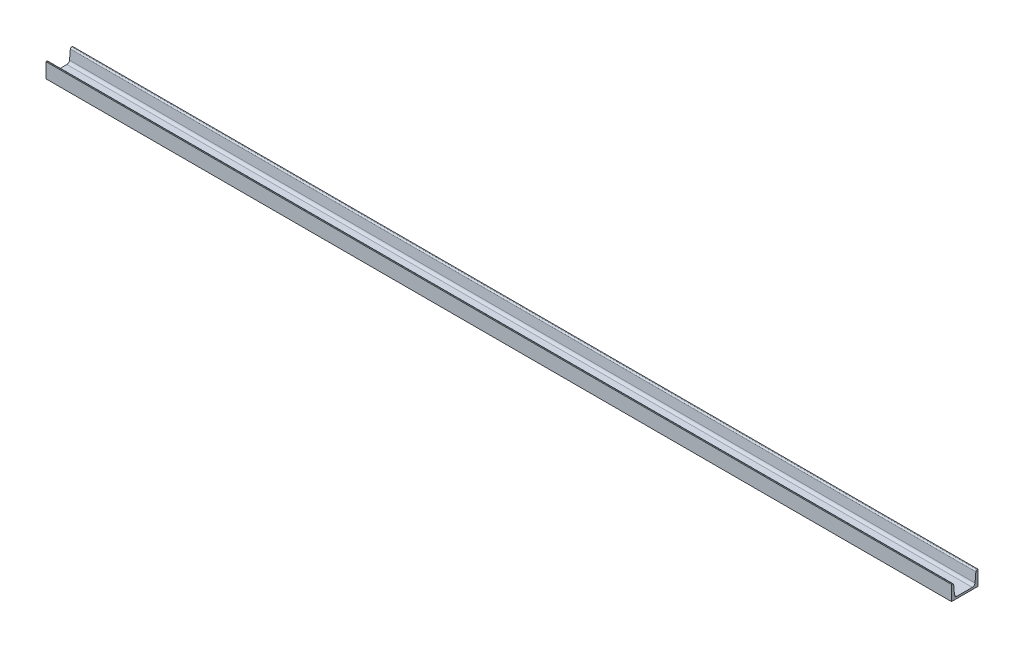
ISO-10303-21;
HEADER;
FILE_DESCRIPTION(('STEP AP214'),'2;1');
FILE_NAME('part.step','',(''),(''),'','','');
FILE_SCHEMA(('AUTOMOTIVE_DESIGN { 1 0 10303 214 1 1 1 1 }'));
ENDSEC;
DATA;
#1=APPLICATION_CONTEXT('core data for automotive mechanical design processes');
#2=APPLICATION_PROTOCOL_DEFINITION('international standard','automotive_design',2000,#1);
#3=PRODUCT_CONTEXT('',#1,'mechanical');
#4=PRODUCT('Part','Part','',(#3));
#5=PRODUCT_RELATED_PRODUCT_CATEGORY('part','',(#4));
#6=PRODUCT_DEFINITION_FORMATION('','',#4);
#7=PRODUCT_DEFINITION_CONTEXT('part definition',#1,'design');
#8=PRODUCT_DEFINITION('design','',#6,#7);
#9=PRODUCT_DEFINITION_SHAPE('','',#8);
#10=(LENGTH_UNIT() NAMED_UNIT(*) SI_UNIT(.MILLI.,.METRE.));
#11=(NAMED_UNIT(*) PLANE_ANGLE_UNIT() SI_UNIT($,.RADIAN.));
#12=(NAMED_UNIT(*) SI_UNIT($,.STERADIAN.) SOLID_ANGLE_UNIT());
#13=UNCERTAINTY_MEASURE_WITH_UNIT(LENGTH_MEASURE(1.E-05),#10,'distance_accuracy_value','');
#14=(GEOMETRIC_REPRESENTATION_CONTEXT(3) GLOBAL_UNCERTAINTY_ASSIGNED_CONTEXT((#13)) GLOBAL_UNIT_ASSIGNED_CONTEXT((#10,
#11,#12)) REPRESENTATION_CONTEXT('',''));
#15=CARTESIAN_POINT('',(0.,0.,0.));
#16=DIRECTION('',(0.,0.,1.));
#17=DIRECTION('',(1.,0.,0.));
#18=AXIS2_PLACEMENT_3D('',#15,#16,#17);
#19=CARTESIAN_POINT('',(1367.5,45.0000000000001,-37.4999999999998));
#20=DIRECTION('',(0.,-1.,0.));
#21=DIRECTION('',(0.,0.,-1.));
#22=AXIS2_PLACEMENT_3D('',#19,#20,#21);
#23=PLANE('',#22);
#24=DIRECTION('',(-1.,0.,0.));
#25=VECTOR('',#24,1.);
#26=CARTESIAN_POINT('',(1367.5,45.0000000000001,-37.4999999999998));
#27=LINE('',#26,#25);
#28=CARTESIAN_POINT('',(1367.5,45.0000000000001,-37.4999999999999));
#29=VERTEX_POINT('',#28);
#30=CARTESIAN_POINT('',(-1367.5,45.0000000000001,-37.4999999999999));
#31=VERTEX_POINT('',#30);
#32=EDGE_CURVE('E120',#29,#31,#27,.T.);
#33=ORIENTED_EDGE('',*,*,#32,.F.);
#34=DIRECTION('',(0.,0.,-1.));
#35=VECTOR('',#34,1.);
#36=CARTESIAN_POINT('',(1367.5,45.0000000000001,-37.4999999999999));
#37=LINE('',#36,#35);
#38=CARTESIAN_POINT('',(1367.5,45.0000000000001,-39.9999999999999));
#39=VERTEX_POINT('',#38);
#40=EDGE_CURVE('E102',#39,#29,#37,.F.);
#41=ORIENTED_EDGE('',*,*,#40,.F.);
#42=DIRECTION('',(1.,0.,0.));
#43=VECTOR('',#42,1.);
#44=CARTESIAN_POINT('',(1367.5,45.0000000000001,-39.9999999999998));
#45=LINE('',#44,#43);
#46=CARTESIAN_POINT('',(-1367.5,45.0000000000001,-40.));
#47=VERTEX_POINT('',#46);
#48=EDGE_CURVE('E160',#39,#47,#45,.F.);
#49=ORIENTED_EDGE('',*,*,#48,.T.);
#50=DIRECTION('',(0.,0.,-1.));
#51=VECTOR('',#50,1.);
#52=CARTESIAN_POINT('',(-1367.5,45.0000000000001,-37.4999999999999));
#53=LINE('',#52,#51);
#54=EDGE_CURVE('E163',#47,#31,#53,.F.);
#55=ORIENTED_EDGE('',*,*,#54,.T.);
#56=EDGE_LOOP('',(#33,#41,#49,#55));
#57=FACE_BOUND('',#56,.T.);
#58=ADVANCED_FACE('F17',(#57),#23,.F.);
#59=CARTESIAN_POINT('',(1367.5,41.0000000000001,-37.4999999999999));
#60=DIRECTION('',(-1.,0.,0.));
#61=DIRECTION('',(0.,0.,1.));
#62=AXIS2_PLACEMENT_3D('',#59,#60,#61);
#63=CYLINDRICAL_SURFACE('',#62,4.);
#64=CARTESIAN_POINT('',(1367.5,41.0000000000001,-37.4999999999999));
#65=DIRECTION('',(-1.,0.,0.));
#66=DIRECTION('',(0.,0.,1.));
#67=AXIS2_PLACEMENT_3D('',#64,#65,#66);
#68=CIRCLE('',#67,4.);
#69=CARTESIAN_POINT('',(1367.5,41.3615760273151,-33.5163756732754));
#70=VERTEX_POINT('',#69);
#71=EDGE_CURVE('E20',#29,#70,#68,.F.);
#72=ORIENTED_EDGE('',*,*,#71,.F.);
#73=ORIENTED_EDGE('',*,*,#32,.T.);
#74=CARTESIAN_POINT('',(-1367.5,41.0000000000001,-37.4999999999999));
#75=DIRECTION('',(-1.,0.,0.));
#76=DIRECTION('',(0.,0.,1.));
#77=AXIS2_PLACEMENT_3D('',#74,#75,#76);
#78=CIRCLE('',#77,4.);
#79=CARTESIAN_POINT('',(-1367.5,41.3615760273151,-33.5163756732754));
#80=VERTEX_POINT('',#79);
#81=EDGE_CURVE('E115',#31,#80,#78,.F.);
#82=ORIENTED_EDGE('',*,*,#81,.T.);
#83=DIRECTION('',(1.,0.,0.));
#84=VECTOR('',#83,1.);
#85=CARTESIAN_POINT('',(1367.5,41.3615760273151,-33.5163756732754));
#86=LINE('',#85,#84);
#87=EDGE_CURVE('E112',#80,#70,#86,.T.);
#88=ORIENTED_EDGE('',*,*,#87,.T.);
#89=EDGE_LOOP('',(#72,#73,#82,#88));
#90=FACE_BOUND('',#89,.T.);
#91=ADVANCED_FACE('F113',(#90),#63,.T.);
#92=CARTESIAN_POINT('',(1367.5,13.2768479453701,-30.9672486534489));
#93=DIRECTION('',(0.,-0.090394006828747,-0.995906081681121));
#94=DIRECTION('',(0.,0.995906081681121,-0.090394006828747));
#95=AXIS2_PLACEMENT_3D('',#92,#93,#94);
#96=PLANE('',#95);
#97=DIRECTION('',(-1.,0.,0.));
#98=VECTOR('',#97,1.);
#99=CARTESIAN_POINT('',(1367.5,13.2768479453701,-30.9672486534489));
#100=LINE('',#99,#98);
#101=CARTESIAN_POINT('',(-1367.5,13.2768479453701,-30.9672486534489));
#102=VERTEX_POINT('',#101);
#103=CARTESIAN_POINT('',(1367.5,13.2768479453701,-30.9672486534489));
#104=VERTEX_POINT('',#103);
#105=EDGE_CURVE('E119',#102,#104,#100,.F.);
#106=ORIENTED_EDGE('',*,*,#105,.T.);
#107=DIRECTION('',(0.,-0.995906081681121,0.0903940068287473));
#108=VECTOR('',#107,1.);
#109=CARTESIAN_POINT('',(1367.5,41.3615760273151,-33.5163756732754));
#110=LINE('',#109,#108);
#111=EDGE_CURVE('E108',#70,#104,#110,.T.);
#112=ORIENTED_EDGE('',*,*,#111,.F.);
#113=ORIENTED_EDGE('',*,*,#87,.F.);
#114=DIRECTION('',(0.,-0.995906081681121,0.0903940068287473));
#115=VECTOR('',#114,1.);
#116=CARTESIAN_POINT('',(-1367.5,41.3615760273151,-33.5163756732754));
#117=LINE('',#116,#115);
#118=EDGE_CURVE('E199',#80,#102,#117,.T.);
#119=ORIENTED_EDGE('',*,*,#118,.T.);
#120=EDGE_LOOP('',(#106,#112,#113,#119));
#121=FACE_BOUND('',#120,.T.);
#122=ADVANCED_FACE('F122',(#121),#96,.F.);
#123=CARTESIAN_POINT('',(1367.5,14.0000000000001,-23.));
#124=DIRECTION('',(-1.,0.,0.));
#125=DIRECTION('',(0.,0.,1.));
#126=AXIS2_PLACEMENT_3D('',#123,#124,#125);
#127=CYLINDRICAL_SURFACE('',#126,8.);
#128=DIRECTION('',(1.,0.,0.));
#129=VECTOR('',#128,1.);
#130=CARTESIAN_POINT('',(1367.5,6.00000000000008,-23.));
#131=LINE('',#130,#129);
#132=CARTESIAN_POINT('',(-1367.5,6.00000000000008,-23.));
#133=VERTEX_POINT('',#132);
#134=CARTESIAN_POINT('',(1367.5,6.00000000000008,-23.));
#135=VERTEX_POINT('',#134);
#136=EDGE_CURVE('E155',#133,#135,#131,.T.);
#137=ORIENTED_EDGE('',*,*,#136,.T.);
#138=CARTESIAN_POINT('',(1367.5,14.0000000000001,-23.));
#139=DIRECTION('',(-1.,0.,0.));
#140=DIRECTION('',(0.,0.,1.));
#141=AXIS2_PLACEMENT_3D('',#138,#139,#140);
#142=CIRCLE('',#141,8.);
#143=EDGE_CURVE('E124',#104,#135,#142,.T.);
#144=ORIENTED_EDGE('',*,*,#143,.F.);
#145=ORIENTED_EDGE('',*,*,#105,.F.);
#146=CARTESIAN_POINT('',(-1367.5,14.0000000000001,-23.));
#147=DIRECTION('',(-1.,0.,0.));
#148=DIRECTION('',(0.,0.,1.));
#149=AXIS2_PLACEMENT_3D('',#146,#147,#148);
#150=CIRCLE('',#149,8.);
#151=EDGE_CURVE('E196',#102,#133,#150,.T.);
#152=ORIENTED_EDGE('',*,*,#151,.T.);
#153=EDGE_LOOP('',(#137,#144,#145,#152));
#154=FACE_BOUND('',#153,.T.);
#155=ADVANCED_FACE('F259',(#154),#127,.F.);
#156=CARTESIAN_POINT('',(1367.5,5.99999999999992,23.));
#157=DIRECTION('',(0.,-1.,0.));
#158=DIRECTION('',(0.,0.,-1.));
#159=AXIS2_PLACEMENT_3D('',#156,#157,#158);
#160=PLANE('',#159);
#161=DIRECTION('',(-1.,0.,0.));
#162=VECTOR('',#161,1.);
#163=CARTESIAN_POINT('',(1367.5,5.99999999999991,23.));
#164=LINE('',#163,#162);
#165=CARTESIAN_POINT('',(-1367.5,6.,23.));
#166=VERTEX_POINT('',#165);
#167=CARTESIAN_POINT('',(1367.5,6.,23.));
#168=VERTEX_POINT('',#167);
#169=EDGE_CURVE('E152',#166,#168,#164,.F.);
#170=ORIENTED_EDGE('',*,*,#169,.T.);
#171=DIRECTION('',(0.,0.,-1.));
#172=VECTOR('',#171,1.);
#173=CARTESIAN_POINT('',(1367.5,6.00000000000008,-37.4999999999999));
#174=LINE('',#173,#172);
#175=EDGE_CURVE('E126',#135,#168,#174,.F.);
#176=ORIENTED_EDGE('',*,*,#175,.F.);
#177=ORIENTED_EDGE('',*,*,#136,.F.);
#178=DIRECTION('',(0.,0.,-1.));
#179=VECTOR('',#178,1.);
#180=CARTESIAN_POINT('',(-1367.5,6.00000000000008,-37.4999999999999));
#181=LINE('',#180,#179);
#182=EDGE_CURVE('E195',#133,#166,#181,.F.);
#183=ORIENTED_EDGE('',*,*,#182,.T.);
#184=EDGE_LOOP('',(#170,#176,#177,#183));
#185=FACE_BOUND('',#184,.T.);
#186=ADVANCED_FACE('F209',(#185),#160,.F.);
#187=CARTESIAN_POINT('',(1367.5,13.9999999999999,23.0000000000001));
#188=DIRECTION('',(-1.,0.,0.));
#189=DIRECTION('',(0.,0.,1.));
#190=AXIS2_PLACEMENT_3D('',#187,#188,#189);
#191=CYLINDRICAL_SURFACE('',#190,8.);
#192=DIRECTION('',(1.,0.,0.));
#193=VECTOR('',#192,1.);
#194=CARTESIAN_POINT('',(1367.5,13.2768479453699,30.967248653449));
#195=LINE('',#194,#193);
#196=CARTESIAN_POINT('',(-1367.5,13.2768479453699,30.967248653449));
#197=VERTEX_POINT('',#196);
#198=CARTESIAN_POINT('',(1367.5,13.2768479453699,30.967248653449));
#199=VERTEX_POINT('',#198);
#200=EDGE_CURVE('E149',#197,#199,#195,.T.);
#201=ORIENTED_EDGE('',*,*,#200,.T.);
#202=CARTESIAN_POINT('',(1367.5,13.9999999999999,23.0000000000001));
#203=DIRECTION('',(-1.,0.,0.));
#204=DIRECTION('',(0.,0.,1.));
#205=AXIS2_PLACEMENT_3D('',#202,#203,#204);
#206=CIRCLE('',#205,8.);
#207=EDGE_CURVE('E204',#168,#199,#206,.T.);
#208=ORIENTED_EDGE('',*,*,#207,.F.);
#209=ORIENTED_EDGE('',*,*,#169,.F.);
#210=CARTESIAN_POINT('',(-1367.5,13.9999999999999,23.0000000000001));
#211=DIRECTION('',(-1.,0.,0.));
#212=DIRECTION('',(0.,0.,1.));
#213=AXIS2_PLACEMENT_3D('',#210,#211,#212);
#214=CIRCLE('',#213,8.);
#215=EDGE_CURVE('E192',#166,#197,#214,.T.);
#216=ORIENTED_EDGE('',*,*,#215,.T.);
#217=EDGE_LOOP('',(#201,#208,#209,#216));
#218=FACE_BOUND('',#217,.T.);
#219=ADVANCED_FACE('F213',(#218),#191,.F.);
#220=CARTESIAN_POINT('',(1367.5,13.2768479453699,30.967248653449));
#221=DIRECTION('',(0.,-0.0903940068287536,0.995906081681121));
#222=DIRECTION('',(0.,-0.995906081681121,-0.0903940068287536));
#223=AXIS2_PLACEMENT_3D('',#220,#221,#222);
#224=PLANE('',#223);
#225=DIRECTION('',(-1.,0.,0.));
#226=VECTOR('',#225,1.);
#227=CARTESIAN_POINT('',(1367.5,41.3615760273148,33.5163756732757));
#228=LINE('',#227,#226);
#229=CARTESIAN_POINT('',(1367.5,41.3615760273149,33.5163756732757));
#230=VERTEX_POINT('',#229);
#231=CARTESIAN_POINT('',(-1367.5,41.3615760273149,33.5163756732757));
#232=VERTEX_POINT('',#231);
#233=EDGE_CURVE('E137',#230,#232,#228,.T.);
#234=ORIENTED_EDGE('',*,*,#233,.F.);
#235=DIRECTION('',(0.,0.995906081681121,0.0903940068287536));
#236=VECTOR('',#235,1.);
#237=CARTESIAN_POINT('',(1367.5,13.2768479453699,30.967248653449));
#238=LINE('',#237,#236);
#239=EDGE_CURVE('E203',#199,#230,#238,.T.);
#240=ORIENTED_EDGE('',*,*,#239,.F.);
#241=ORIENTED_EDGE('',*,*,#200,.F.);
#242=DIRECTION('',(0.,0.995906081681121,0.0903940068287536));
#243=VECTOR('',#242,1.);
#244=CARTESIAN_POINT('',(-1367.5,13.2768479453699,30.967248653449));
#245=LINE('',#244,#243);
#246=EDGE_CURVE('E191',#197,#232,#245,.T.);
#247=ORIENTED_EDGE('',*,*,#246,.T.);
#248=EDGE_LOOP('',(#234,#240,#241,#247));
#249=FACE_BOUND('',#248,.T.);
#250=ADVANCED_FACE('F219',(#249),#224,.F.);
#251=CARTESIAN_POINT('',(1367.5,40.9999999999998,37.5000000000001));
#252=DIRECTION('',(-1.,0.,0.));
#253=DIRECTION('',(0.,0.,1.));
#254=AXIS2_PLACEMENT_3D('',#251,#252,#253);
#255=CYLINDRICAL_SURFACE('',#254,4.);
#256=CARTESIAN_POINT('',(1367.5,40.9999999999998,37.5000000000001));
#257=DIRECTION('',(-1.,0.,0.));
#258=DIRECTION('',(0.,0.,1.));
#259=AXIS2_PLACEMENT_3D('',#256,#257,#258);
#260=CIRCLE('',#259,4.);
#261=CARTESIAN_POINT('',(1367.5,44.9999999999998,37.5000000000001));
#262=VERTEX_POINT('',#261);
#263=EDGE_CURVE('E201',#230,#262,#260,.F.);
#264=ORIENTED_EDGE('',*,*,#263,.F.);
#265=ORIENTED_EDGE('',*,*,#233,.T.);
#266=CARTESIAN_POINT('',(-1367.5,40.9999999999998,37.5000000000001));
#267=DIRECTION('',(-1.,0.,0.));
#268=DIRECTION('',(0.,0.,1.));
#269=AXIS2_PLACEMENT_3D('',#266,#267,#268);
#270=CIRCLE('',#269,4.);
#271=CARTESIAN_POINT('',(-1367.5,44.9999999999998,37.5000000000001));
#272=VERTEX_POINT('',#271);
#273=EDGE_CURVE('E188',#232,#272,#270,.F.);
#274=ORIENTED_EDGE('',*,*,#273,.T.);
#275=DIRECTION('',(1.,0.,0.));
#276=VECTOR('',#275,1.);
#277=CARTESIAN_POINT('',(1367.5,44.9999999999998,37.5000000000001));
#278=LINE('',#277,#276);
#279=EDGE_CURVE('E134',#272,#262,#278,.T.);
#280=ORIENTED_EDGE('',*,*,#279,.T.);
#281=EDGE_LOOP('',(#264,#265,#274,#280));
#282=FACE_BOUND('',#281,.T.);
#283=ADVANCED_FACE('F223',(#282),#255,.T.);
#284=CARTESIAN_POINT('',(1367.5,44.9999999999998,37.5000000000001));
#285=DIRECTION('',(0.,-1.,0.));
#286=DIRECTION('',(0.,0.,-1.));
#287=AXIS2_PLACEMENT_3D('',#284,#285,#286);
#288=PLANE('',#287);
#289=DIRECTION('',(1.,0.,0.));
#290=VECTOR('',#289,1.);
#291=CARTESIAN_POINT('',(1367.5,44.9999999999998,40.0000000000002));
#292=LINE('',#291,#290);
#293=CARTESIAN_POINT('',(-1367.5,44.9999999999998,40.0000000000002));
#294=VERTEX_POINT('',#293);
#295=CARTESIAN_POINT('',(1367.5,44.9999999999998,40.0000000000002));
#296=VERTEX_POINT('',#295);
#297=EDGE_CURVE('E131',#294,#296,#292,.T.);
#298=ORIENTED_EDGE('',*,*,#297,.T.);
#299=DIRECTION('',(0.,0.,-1.));
#300=VECTOR('',#299,1.);
#301=CARTESIAN_POINT('',(1367.5,44.9999999999998,-37.4999999999999));
#302=LINE('',#301,#300);
#303=EDGE_CURVE('E185',#262,#296,#302,.F.);
#304=ORIENTED_EDGE('',*,*,#303,.F.);
#305=ORIENTED_EDGE('',*,*,#279,.F.);
#306=DIRECTION('',(0.,0.,-1.));
#307=VECTOR('',#306,1.);
#308=CARTESIAN_POINT('',(-1367.5,44.9999999999998,-37.4999999999999));
#309=LINE('',#308,#307);
#310=EDGE_CURVE('E141',#272,#294,#309,.F.);
#311=ORIENTED_EDGE('',*,*,#310,.T.);
#312=EDGE_LOOP('',(#298,#304,#305,#311));
#313=FACE_BOUND('',#312,.T.);
#314=ADVANCED_FACE('F228',(#313),#288,.F.);
#315=CARTESIAN_POINT('',(1367.5,-1.40540629029306E-13,40.));
#316=DIRECTION('',(0.,0.,-1.));
#317=DIRECTION('',(0.,1.,0.));
#318=AXIS2_PLACEMENT_3D('',#315,#316,#317);
#319=PLANE('',#318);
#320=DIRECTION('',(1.,0.,0.));
#321=VECTOR('',#320,1.);
#322=CARTESIAN_POINT('',(1367.5,-1.40540629029306E-13,40.));
#323=LINE('',#322,#321);
#324=CARTESIAN_POINT('',(-1367.5,-1.40099941291516E-13,40.));
#325=VERTEX_POINT('',#324);
#326=CARTESIAN_POINT('',(1367.5,-1.40099941291516E-13,40.));
#327=VERTEX_POINT('',#326);
#328=EDGE_CURVE('E168',#325,#327,#323,.T.);
#329=ORIENTED_EDGE('',*,*,#328,.T.);
#330=DIRECTION('',(0.,1.,0.));
#331=VECTOR('',#330,1.);
#332=CARTESIAN_POINT('',(1367.5,41.0000000000001,40.0000000000002));
#333=LINE('',#332,#331);
#334=EDGE_CURVE('E172',#296,#327,#333,.F.);
#335=ORIENTED_EDGE('',*,*,#334,.F.);
#336=ORIENTED_EDGE('',*,*,#297,.F.);
#337=DIRECTION('',(0.,1.,0.));
#338=VECTOR('',#337,1.);
#339=CARTESIAN_POINT('',(-1367.5,41.0000000000001,40.0000000000002));
#340=LINE('',#339,#338);
#341=EDGE_CURVE('E138',#294,#325,#340,.F.);
#342=ORIENTED_EDGE('',*,*,#341,.T.);
#343=EDGE_LOOP('',(#329,#335,#336,#342));
#344=FACE_BOUND('',#343,.T.);
#345=ADVANCED_FACE('F246',(#344),#319,.F.);
#346=CARTESIAN_POINT('',(1367.5,41.0000000000001,-37.4999999999999));
#347=DIRECTION('',(1.,0.,0.));
#348=DIRECTION('',(0.,0.,-1.));
#349=AXIS2_PLACEMENT_3D('',#346,#347,#348);
#350=PLANE('',#349);
#351=ORIENTED_EDGE('',*,*,#334,.T.);
#352=DIRECTION('',(0.,0.,1.));
#353=VECTOR('',#352,1.);
#354=CARTESIAN_POINT('',(1367.5,-1.40540629029306E-13,40.));
#355=LINE('',#354,#353);
#356=CARTESIAN_POINT('',(1367.5,0.,-40.));
#357=VERTEX_POINT('',#356);
#358=EDGE_CURVE('E177',#327,#357,#355,.F.);
#359=ORIENTED_EDGE('',*,*,#358,.T.);
#360=DIRECTION('',(0.,-1.,0.));
#361=VECTOR('',#360,1.);
#362=CARTESIAN_POINT('',(1367.5,1.38777878078145E-13,-40.));
#363=LINE('',#362,#361);
#364=EDGE_CURVE('E164',#357,#39,#363,.F.);
#365=ORIENTED_EDGE('',*,*,#364,.T.);
#366=ORIENTED_EDGE('',*,*,#40,.T.);
#367=ORIENTED_EDGE('',*,*,#71,.T.);
#368=ORIENTED_EDGE('',*,*,#111,.T.);
#369=ORIENTED_EDGE('',*,*,#143,.T.);
#370=ORIENTED_EDGE('',*,*,#175,.T.);
#371=ORIENTED_EDGE('',*,*,#207,.T.);
#372=ORIENTED_EDGE('',*,*,#239,.T.);
#373=ORIENTED_EDGE('',*,*,#263,.T.);
#374=ORIENTED_EDGE('',*,*,#303,.T.);
#375=EDGE_LOOP('',(#351,#359,#365,#366,#367,#368,#369,#370,#371,#372,#373,#374));
#376=FACE_BOUND('',#375,.T.);
#377=ADVANCED_FACE('F106',(#376),#350,.T.);
#378=CARTESIAN_POINT('',(1367.5,1.38777878078145E-13,-40.));
#379=DIRECTION('',(0.,0.,1.));
#380=DIRECTION('',(0.,-1.,0.));
#381=AXIS2_PLACEMENT_3D('',#378,#379,#380);
#382=PLANE('',#381);
#383=ORIENTED_EDGE('',*,*,#48,.F.);
#384=ORIENTED_EDGE('',*,*,#364,.F.);
#385=DIRECTION('',(1.,0.,0.));
#386=VECTOR('',#385,1.);
#387=CARTESIAN_POINT('',(1367.5,1.38777878078145E-13,-40.));
#388=LINE('',#387,#386);
#389=CARTESIAN_POINT('',(-1367.5,0.,-40.));
#390=VERTEX_POINT('',#389);
#391=EDGE_CURVE('E26',#357,#390,#388,.F.);
#392=ORIENTED_EDGE('',*,*,#391,.T.);
#393=DIRECTION('',(0.,1.,0.));
#394=VECTOR('',#393,1.);
#395=CARTESIAN_POINT('',(-1367.5,41.0000000000001,-40.));
#396=LINE('',#395,#394);
#397=EDGE_CURVE('E34',#390,#47,#396,.T.);
#398=ORIENTED_EDGE('',*,*,#397,.T.);
#399=EDGE_LOOP('',(#383,#384,#392,#398));
#400=FACE_BOUND('',#399,.T.);
#401=ADVANCED_FACE('F254',(#400),#382,.F.);
#402=CARTESIAN_POINT('',(-1367.5,41.0000000000001,-37.4999999999999));
#403=DIRECTION('',(1.,0.,0.));
#404=DIRECTION('',(0.,0.,-1.));
#405=AXIS2_PLACEMENT_3D('',#402,#403,#404);
#406=PLANE('',#405);
#407=DIRECTION('',(0.,0.,1.));
#408=VECTOR('',#407,1.);
#409=CARTESIAN_POINT('',(-1367.5,-1.40540629029306E-13,40.));
#410=LINE('',#409,#408);
#411=EDGE_CURVE('E11',#390,#325,#410,.T.);
#412=ORIENTED_EDGE('',*,*,#411,.T.);
#413=ORIENTED_EDGE('',*,*,#341,.F.);
#414=ORIENTED_EDGE('',*,*,#310,.F.);
#415=ORIENTED_EDGE('',*,*,#273,.F.);
#416=ORIENTED_EDGE('',*,*,#246,.F.);
#417=ORIENTED_EDGE('',*,*,#215,.F.);
#418=ORIENTED_EDGE('',*,*,#182,.F.);
#419=ORIENTED_EDGE('',*,*,#151,.F.);
#420=ORIENTED_EDGE('',*,*,#118,.F.);
#421=ORIENTED_EDGE('',*,*,#81,.F.);
#422=ORIENTED_EDGE('',*,*,#54,.F.);
#423=ORIENTED_EDGE('',*,*,#397,.F.);
#424=EDGE_LOOP('',(#412,#413,#414,#415,#416,#417,#418,#419,#420,#421,#422,#423));
#425=FACE_BOUND('',#424,.T.);
#426=ADVANCED_FACE('F256',(#425),#406,.F.);
#427=CARTESIAN_POINT('',(1367.5,-1.40540629029306E-13,40.));
#428=DIRECTION('',(0.,1.,0.));
#429=DIRECTION('',(0.,0.,1.));
#430=AXIS2_PLACEMENT_3D('',#427,#428,#429);
#431=PLANE('',#430);
#432=ORIENTED_EDGE('',*,*,#391,.F.);
#433=ORIENTED_EDGE('',*,*,#358,.F.);
#434=ORIENTED_EDGE('',*,*,#328,.F.);
#435=ORIENTED_EDGE('',*,*,#411,.F.);
#436=EDGE_LOOP('',(#432,#433,#434,#435));
#437=FACE_BOUND('',#436,.T.);
#438=ADVANCED_FACE('F251',(#437),#431,.F.);
#439=CLOSED_SHELL('',(#58,#91,#122,#155,#186,#219,#250,#283,#314,#345,#377,#401,#426,#438));
#440=MANIFOLD_SOLID_BREP('B1',#439);
#441=ADVANCED_BREP_SHAPE_REPRESENTATION('',(#18,#440),#14);
#442=SHAPE_DEFINITION_REPRESENTATION(#9,#441);
ENDSEC;
END-ISO-10303-21;
